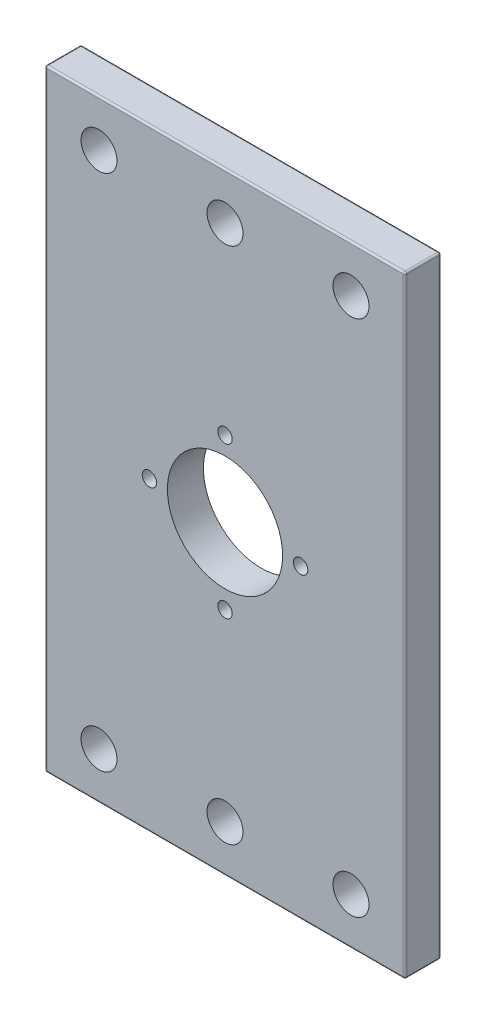
ISO-10303-21;
HEADER;
FILE_DESCRIPTION(('STEP AP214'),'2;1');
FILE_NAME('part.step','',(''),(''),'','','');
FILE_SCHEMA(('AUTOMOTIVE_DESIGN { 1 0 10303 214 1 1 1 1 }'));
ENDSEC;
DATA;
#1=APPLICATION_CONTEXT('core data for automotive mechanical design processes');
#2=APPLICATION_PROTOCOL_DEFINITION('international standard','automotive_design',2000,#1);
#3=PRODUCT_CONTEXT('',#1,'mechanical');
#4=PRODUCT('Part','Part','',(#3));
#5=PRODUCT_RELATED_PRODUCT_CATEGORY('part','',(#4));
#6=PRODUCT_DEFINITION_FORMATION('','',#4);
#7=PRODUCT_DEFINITION_CONTEXT('part definition',#1,'design');
#8=PRODUCT_DEFINITION('design','',#6,#7);
#9=PRODUCT_DEFINITION_SHAPE('','',#8);
#10=(LENGTH_UNIT() NAMED_UNIT(*) SI_UNIT(.MILLI.,.METRE.));
#11=(NAMED_UNIT(*) PLANE_ANGLE_UNIT() SI_UNIT($,.RADIAN.));
#12=(NAMED_UNIT(*) SI_UNIT($,.STERADIAN.) SOLID_ANGLE_UNIT());
#13=UNCERTAINTY_MEASURE_WITH_UNIT(LENGTH_MEASURE(1.E-05),#10,'distance_accuracy_value','');
#14=(GEOMETRIC_REPRESENTATION_CONTEXT(3) GLOBAL_UNCERTAINTY_ASSIGNED_CONTEXT((#13)) GLOBAL_UNIT_ASSIGNED_CONTEXT((#10,
#11,#12)) REPRESENTATION_CONTEXT('',''));
#15=CARTESIAN_POINT('',(0.,0.,0.));
#16=DIRECTION('',(0.,0.,1.));
#17=DIRECTION('',(1.,0.,0.));
#18=AXIS2_PLACEMENT_3D('',#15,#16,#17);
#19=CARTESIAN_POINT('',(50.,85.,10.));
#20=DIRECTION('',(0.,-1.,0.));
#21=DIRECTION('',(1.,0.,0.));
#22=AXIS2_PLACEMENT_3D('',#19,#20,#21);
#23=PLANE('',#22);
#24=DIRECTION('',(0.,0.,-1.));
#25=VECTOR('',#24,1.);
#26=CARTESIAN_POINT('',(49.5,85.,0.));
#27=LINE('',#26,#25);
#28=CARTESIAN_POINT('',(49.5,85.,9.5));
#29=VERTEX_POINT('',#28);
#30=CARTESIAN_POINT('',(49.5,85.,0.5));
#31=VERTEX_POINT('',#30);
#32=EDGE_CURVE('E60',#29,#31,#27,.T.);
#33=ORIENTED_EDGE('',*,*,#32,.T.);
#34=DIRECTION('',(-1.,0.,0.));
#35=VECTOR('',#34,1.);
#36=CARTESIAN_POINT('',(50.,85.,0.5));
#37=LINE('',#36,#35);
#38=CARTESIAN_POINT('',(-49.5,85.,0.5));
#39=VERTEX_POINT('',#38);
#40=EDGE_CURVE('E11',#31,#39,#37,.T.);
#41=ORIENTED_EDGE('',*,*,#40,.T.);
#42=DIRECTION('',(0.,0.,-1.));
#43=VECTOR('',#42,1.);
#44=CARTESIAN_POINT('',(-49.5,85.,10.));
#45=LINE('',#44,#43);
#46=CARTESIAN_POINT('',(-49.5,85.,9.5));
#47=VERTEX_POINT('',#46);
#48=EDGE_CURVE('E49',#39,#47,#45,.F.);
#49=ORIENTED_EDGE('',*,*,#48,.T.);
#50=DIRECTION('',(-1.,0.,0.));
#51=VECTOR('',#50,1.);
#52=CARTESIAN_POINT('',(50.,85.,9.5));
#53=LINE('',#52,#51);
#54=EDGE_CURVE('E225',#47,#29,#53,.F.);
#55=ORIENTED_EDGE('',*,*,#54,.T.);
#56=EDGE_LOOP('',(#33,#41,#49,#55));
#57=FACE_BOUND('',#56,.T.);
#58=ADVANCED_FACE('F39',(#57),#23,.F.);
#59=CARTESIAN_POINT('',(-50.,-85.,10.));
#60=DIRECTION('',(-1.,0.,0.));
#61=DIRECTION('',(0.,-1.,0.));
#62=AXIS2_PLACEMENT_3D('',#59,#60,#61);
#63=PLANE('',#62);
#64=DIRECTION('',(0.,0.,-1.));
#65=VECTOR('',#64,1.);
#66=CARTESIAN_POINT('',(-50.,84.5,0.));
#67=LINE('',#66,#65);
#68=CARTESIAN_POINT('',(-50.,84.5,9.5));
#69=VERTEX_POINT('',#68);
#70=CARTESIAN_POINT('',(-50.,84.5,0.5));
#71=VERTEX_POINT('',#70);
#72=EDGE_CURVE('E215',#69,#71,#67,.T.);
#73=ORIENTED_EDGE('',*,*,#72,.T.);
#74=DIRECTION('',(0.,1.,0.));
#75=VECTOR('',#74,1.);
#76=CARTESIAN_POINT('',(-50.,-85.,0.5));
#77=LINE('',#76,#75);
#78=CARTESIAN_POINT('',(-50.,-84.5,0.5));
#79=VERTEX_POINT('',#78);
#80=EDGE_CURVE('E222',#71,#79,#77,.F.);
#81=ORIENTED_EDGE('',*,*,#80,.T.);
#82=DIRECTION('',(0.,0.,-1.));
#83=VECTOR('',#82,1.);
#84=CARTESIAN_POINT('',(-50.,-84.5,10.));
#85=LINE('',#84,#83);
#86=CARTESIAN_POINT('',(-50.,-84.5,9.5));
#87=VERTEX_POINT('',#86);
#88=EDGE_CURVE('E218',#79,#87,#85,.F.);
#89=ORIENTED_EDGE('',*,*,#88,.T.);
#90=DIRECTION('',(0.,1.,0.));
#91=VECTOR('',#90,1.);
#92=CARTESIAN_POINT('',(-50.,-85.,9.5));
#93=LINE('',#92,#91);
#94=EDGE_CURVE('E212',#87,#69,#93,.T.);
#95=ORIENTED_EDGE('',*,*,#94,.T.);
#96=EDGE_LOOP('',(#73,#81,#89,#95));
#97=FACE_BOUND('',#96,.T.);
#98=ADVANCED_FACE('F417',(#97),#63,.T.);
#99=CARTESIAN_POINT('',(50.,-85.,10.));
#100=DIRECTION('',(0.,-1.,0.));
#101=DIRECTION('',(1.,0.,0.));
#102=AXIS2_PLACEMENT_3D('',#99,#100,#101);
#103=PLANE('',#102);
#104=DIRECTION('',(-1.,0.,0.));
#105=VECTOR('',#104,1.);
#106=CARTESIAN_POINT('',(50.,-85.,0.5));
#107=LINE('',#106,#105);
#108=CARTESIAN_POINT('',(-49.5,-85.,0.5));
#109=VERTEX_POINT('',#108);
#110=CARTESIAN_POINT('',(49.5,-85.,0.5));
#111=VERTEX_POINT('',#110);
#112=EDGE_CURVE('E135',#109,#111,#107,.F.);
#113=ORIENTED_EDGE('',*,*,#112,.T.);
#114=DIRECTION('',(0.,0.,-1.));
#115=VECTOR('',#114,1.);
#116=CARTESIAN_POINT('',(49.5,-85.,10.));
#117=LINE('',#116,#115);
#118=CARTESIAN_POINT('',(49.5,-85.,9.5));
#119=VERTEX_POINT('',#118);
#120=EDGE_CURVE('E183',#111,#119,#117,.F.);
#121=ORIENTED_EDGE('',*,*,#120,.T.);
#122=DIRECTION('',(-1.,0.,0.));
#123=VECTOR('',#122,1.);
#124=CARTESIAN_POINT('',(50.,-85.,9.5));
#125=LINE('',#124,#123);
#126=CARTESIAN_POINT('',(-49.5,-85.,9.5));
#127=VERTEX_POINT('',#126);
#128=EDGE_CURVE('E178',#119,#127,#125,.T.);
#129=ORIENTED_EDGE('',*,*,#128,.T.);
#130=DIRECTION('',(0.,0.,-1.));
#131=VECTOR('',#130,1.);
#132=CARTESIAN_POINT('',(-49.5,-85.,10.));
#133=LINE('',#132,#131);
#134=EDGE_CURVE('E172',#127,#109,#133,.T.);
#135=ORIENTED_EDGE('',*,*,#134,.T.);
#136=EDGE_LOOP('',(#113,#121,#129,#135));
#137=FACE_BOUND('',#136,.T.);
#138=ADVANCED_FACE('F412',(#137),#103,.T.);
#139=CARTESIAN_POINT('',(50.,0.,10.));
#140=DIRECTION('',(1.,0.,0.));
#141=DIRECTION('',(0.,1.,0.));
#142=AXIS2_PLACEMENT_3D('',#139,#140,#141);
#143=PLANE('',#142);
#144=DIRECTION('',(0.,0.,-1.));
#145=VECTOR('',#144,1.);
#146=CARTESIAN_POINT('',(50.,-84.5,10.));
#147=LINE('',#146,#145);
#148=CARTESIAN_POINT('',(50.,-84.5,9.5));
#149=VERTEX_POINT('',#148);
#150=CARTESIAN_POINT('',(50.,-84.5,0.5));
#151=VERTEX_POINT('',#150);
#152=EDGE_CURVE('E205',#149,#151,#147,.T.);
#153=ORIENTED_EDGE('',*,*,#152,.T.);
#154=DIRECTION('',(0.,-1.,0.));
#155=VECTOR('',#154,1.);
#156=CARTESIAN_POINT('',(50.,85.,0.5));
#157=LINE('',#156,#155);
#158=CARTESIAN_POINT('',(50.,84.5,0.5));
#159=VERTEX_POINT('',#158);
#160=EDGE_CURVE('E209',#151,#159,#157,.F.);
#161=ORIENTED_EDGE('',*,*,#160,.T.);
#162=DIRECTION('',(0.,0.,-1.));
#163=VECTOR('',#162,1.);
#164=CARTESIAN_POINT('',(50.,84.5,10.));
#165=LINE('',#164,#163);
#166=CARTESIAN_POINT('',(50.,84.5,9.5));
#167=VERTEX_POINT('',#166);
#168=EDGE_CURVE('E202',#159,#167,#165,.F.);
#169=ORIENTED_EDGE('',*,*,#168,.T.);
#170=DIRECTION('',(0.,1.,0.));
#171=VECTOR('',#170,1.);
#172=CARTESIAN_POINT('',(50.,0.,9.5));
#173=LINE('',#172,#171);
#174=EDGE_CURVE('E199',#167,#149,#173,.F.);
#175=ORIENTED_EDGE('',*,*,#174,.T.);
#176=EDGE_LOOP('',(#153,#161,#169,#175));
#177=FACE_BOUND('',#176,.T.);
#178=ADVANCED_FACE('F404',(#177),#143,.T.);
#179=CARTESIAN_POINT('',(0.,0.,10.));
#180=DIRECTION('',(0.,0.,1.));
#181=DIRECTION('',(1.,0.,0.));
#182=AXIS2_PLACEMENT_3D('',#179,#180,#181);
#183=PLANE('',#182);
#184=DIRECTION('',(-1.,0.,0.));
#185=VECTOR('',#184,1.);
#186=CARTESIAN_POINT('',(0.,-84.5,10.));
#187=LINE('',#186,#185);
#188=CARTESIAN_POINT('',(-49.5,-84.5,10.));
#189=VERTEX_POINT('',#188);
#190=CARTESIAN_POINT('',(49.5,-84.5,10.));
#191=VERTEX_POINT('',#190);
#192=EDGE_CURVE('E192',#189,#191,#187,.F.);
#193=ORIENTED_EDGE('',*,*,#192,.T.);
#194=DIRECTION('',(0.,1.,0.));
#195=VECTOR('',#194,1.);
#196=CARTESIAN_POINT('',(49.5,0.,10.));
#197=LINE('',#196,#195);
#198=CARTESIAN_POINT('',(49.5,84.5,10.));
#199=VERTEX_POINT('',#198);
#200=EDGE_CURVE('E196',#191,#199,#197,.T.);
#201=ORIENTED_EDGE('',*,*,#200,.T.);
#202=DIRECTION('',(-1.,0.,0.));
#203=VECTOR('',#202,1.);
#204=CARTESIAN_POINT('',(-50.,84.5,10.));
#205=LINE('',#204,#203);
#206=CARTESIAN_POINT('',(-49.5,84.5,10.));
#207=VERTEX_POINT('',#206);
#208=EDGE_CURVE('E189',#199,#207,#205,.T.);
#209=ORIENTED_EDGE('',*,*,#208,.T.);
#210=DIRECTION('',(0.,1.,0.));
#211=VECTOR('',#210,1.);
#212=CARTESIAN_POINT('',(-49.5,0.,10.));
#213=LINE('',#212,#211);
#214=EDGE_CURVE('E186',#207,#189,#213,.F.);
#215=ORIENTED_EDGE('',*,*,#214,.T.);
#216=EDGE_LOOP('',(#193,#201,#209,#215));
#217=FACE_BOUND('',#216,.T.);
#218=CARTESIAN_POINT('',(-35.,72.,10.));
#219=DIRECTION('',(0.,0.,-1.));
#220=DIRECTION('',(1.,0.,0.));
#221=AXIS2_PLACEMENT_3D('',#218,#219,#220);
#222=CIRCLE('',#221,5.);
#223=CARTESIAN_POINT('',(-30.,72.,10.));
#224=VERTEX_POINT('',#223);
#225=EDGE_CURVE('E310',#224,#224,#222,.T.);
#226=ORIENTED_EDGE('',*,*,#225,.T.);
#227=EDGE_LOOP('',(#226));
#228=FACE_BOUND('',#227,.T.);
#229=CARTESIAN_POINT('',(35.,72.,10.));
#230=DIRECTION('',(0.,0.,-1.));
#231=DIRECTION('',(1.,0.,0.));
#232=AXIS2_PLACEMENT_3D('',#229,#230,#231);
#233=CIRCLE('',#232,5.);
#234=CARTESIAN_POINT('',(40.,72.,10.));
#235=VERTEX_POINT('',#234);
#236=EDGE_CURVE('E323',#235,#235,#233,.T.);
#237=ORIENTED_EDGE('',*,*,#236,.T.);
#238=EDGE_LOOP('',(#237));
#239=FACE_BOUND('',#238,.T.);
#240=CARTESIAN_POINT('',(0.,72.,10.));
#241=DIRECTION('',(0.,0.,-1.));
#242=DIRECTION('',(1.,0.,0.));
#243=AXIS2_PLACEMENT_3D('',#240,#241,#242);
#244=CIRCLE('',#243,5.);
#245=CARTESIAN_POINT('',(5.00000000000001,72.,10.));
#246=VERTEX_POINT('',#245);
#247=EDGE_CURVE('E332',#246,#246,#244,.T.);
#248=ORIENTED_EDGE('',*,*,#247,.T.);
#249=EDGE_LOOP('',(#248));
#250=FACE_BOUND('',#249,.T.);
#251=CARTESIAN_POINT('',(-21.,0.,10.));
#252=DIRECTION('',(0.,0.,1.));
#253=DIRECTION('',(0.,1.,0.));
#254=AXIS2_PLACEMENT_3D('',#251,#252,#253);
#255=CIRCLE('',#254,2.);
#256=CARTESIAN_POINT('',(-21.,1.99999999999993,10.));
#257=VERTEX_POINT('',#256);
#258=EDGE_CURVE('E342',#257,#257,#255,.T.);
#259=ORIENTED_EDGE('',*,*,#258,.F.);
#260=EDGE_LOOP('',(#259));
#261=FACE_BOUND('',#260,.T.);
#262=CARTESIAN_POINT('',(0.,-21.,10.));
#263=DIRECTION('',(0.,0.,1.));
#264=DIRECTION('',(-1.,0.,0.));
#265=AXIS2_PLACEMENT_3D('',#262,#263,#264);
#266=CIRCLE('',#265,2.);
#267=CARTESIAN_POINT('',(-2.,-21.,10.));
#268=VERTEX_POINT('',#267);
#269=EDGE_CURVE('E350',#268,#268,#266,.T.);
#270=ORIENTED_EDGE('',*,*,#269,.F.);
#271=EDGE_LOOP('',(#270));
#272=FACE_BOUND('',#271,.T.);
#273=CARTESIAN_POINT('',(21.,2.19963324347117E-13,10.));
#274=DIRECTION('',(0.,0.,1.));
#275=DIRECTION('',(0.,-1.,0.));
#276=AXIS2_PLACEMENT_3D('',#273,#274,#275);
#277=CIRCLE('',#276,2.);
#278=CARTESIAN_POINT('',(21.,-1.99999999999978,10.));
#279=VERTEX_POINT('',#278);
#280=EDGE_CURVE('E331',#279,#279,#277,.T.);
#281=ORIENTED_EDGE('',*,*,#280,.F.);
#282=EDGE_LOOP('',(#281));
#283=FACE_BOUND('',#282,.T.);
#284=CARTESIAN_POINT('',(0.,21.,10.));
#285=DIRECTION('',(0.,0.,1.));
#286=DIRECTION('',(1.,0.,0.));
#287=AXIS2_PLACEMENT_3D('',#284,#285,#286);
#288=CIRCLE('',#287,2.);
#289=CARTESIAN_POINT('',(2.,21.,10.));
#290=VERTEX_POINT('',#289);
#291=EDGE_CURVE('E341',#290,#290,#288,.T.);
#292=ORIENTED_EDGE('',*,*,#291,.F.);
#293=EDGE_LOOP('',(#292));
#294=FACE_BOUND('',#293,.T.);
#295=CARTESIAN_POINT('',(-35.,-72.,10.));
#296=DIRECTION('',(0.,0.,1.));
#297=DIRECTION('',(1.,0.,0.));
#298=AXIS2_PLACEMENT_3D('',#295,#296,#297);
#299=CIRCLE('',#298,5.);
#300=CARTESIAN_POINT('',(-30.,-72.,10.));
#301=VERTEX_POINT('',#300);
#302=EDGE_CURVE('E365',#301,#301,#299,.T.);
#303=ORIENTED_EDGE('',*,*,#302,.F.);
#304=EDGE_LOOP('',(#303));
#305=FACE_BOUND('',#304,.T.);
#306=CARTESIAN_POINT('',(35.,-72.,10.));
#307=DIRECTION('',(0.,0.,1.));
#308=DIRECTION('',(1.,0.,0.));
#309=AXIS2_PLACEMENT_3D('',#306,#307,#308);
#310=CIRCLE('',#309,5.);
#311=CARTESIAN_POINT('',(40.,-72.,10.));
#312=VERTEX_POINT('',#311);
#313=EDGE_CURVE('E374',#312,#312,#310,.T.);
#314=ORIENTED_EDGE('',*,*,#313,.F.);
#315=EDGE_LOOP('',(#314));
#316=FACE_BOUND('',#315,.T.);
#317=CARTESIAN_POINT('',(0.,-72.,10.));
#318=DIRECTION('',(0.,0.,1.));
#319=DIRECTION('',(1.,0.,0.));
#320=AXIS2_PLACEMENT_3D('',#317,#318,#319);
#321=CIRCLE('',#320,5.);
#322=CARTESIAN_POINT('',(5.00000000000001,-72.,10.));
#323=VERTEX_POINT('',#322);
#324=EDGE_CURVE('E373',#323,#323,#321,.T.);
#325=ORIENTED_EDGE('',*,*,#324,.F.);
#326=EDGE_LOOP('',(#325));
#327=FACE_BOUND('',#326,.T.);
#328=CARTESIAN_POINT('',(0.,0.,10.));
#329=DIRECTION('',(0.,0.,1.));
#330=DIRECTION('',(1.,0.,0.));
#331=AXIS2_PLACEMENT_3D('',#328,#329,#330);
#332=CIRCLE('',#331,16.);
#333=CARTESIAN_POINT('',(16.,0.,10.));
#334=VERTEX_POINT('',#333);
#335=EDGE_CURVE('E389',#334,#334,#332,.T.);
#336=ORIENTED_EDGE('',*,*,#335,.F.);
#337=EDGE_LOOP('',(#336));
#338=FACE_BOUND('',#337,.T.);
#339=ADVANCED_FACE('F402',(#217,#228,#239,#250,#261,#272,#283,#294,#305,#316,#327,#338),#183,.T.);
#340=CARTESIAN_POINT('',(0.,0.,0.));
#341=DIRECTION('',(0.,0.,1.));
#342=DIRECTION('',(1.,0.,0.));
#343=AXIS2_PLACEMENT_3D('',#340,#341,#342);
#344=PLANE('',#343);
#345=DIRECTION('',(-1.,0.,0.));
#346=VECTOR('',#345,1.);
#347=CARTESIAN_POINT('',(0.,84.5,0.));
#348=LINE('',#347,#346);
#349=CARTESIAN_POINT('',(-49.5,84.5,0.));
#350=VERTEX_POINT('',#349);
#351=CARTESIAN_POINT('',(49.5,84.5,0.));
#352=VERTEX_POINT('',#351);
#353=EDGE_CURVE('E160',#350,#352,#348,.F.);
#354=ORIENTED_EDGE('',*,*,#353,.T.);
#355=DIRECTION('',(0.,-1.,0.));
#356=VECTOR('',#355,1.);
#357=CARTESIAN_POINT('',(49.5,-85.,0.));
#358=LINE('',#357,#356);
#359=CARTESIAN_POINT('',(49.5,-84.5,0.));
#360=VERTEX_POINT('',#359);
#361=EDGE_CURVE('E166',#352,#360,#358,.T.);
#362=ORIENTED_EDGE('',*,*,#361,.T.);
#363=DIRECTION('',(-1.,0.,0.));
#364=VECTOR('',#363,1.);
#365=CARTESIAN_POINT('',(-50.,-84.5,0.));
#366=LINE('',#365,#364);
#367=CARTESIAN_POINT('',(-49.5,-84.5,0.));
#368=VERTEX_POINT('',#367);
#369=EDGE_CURVE('E133',#360,#368,#366,.T.);
#370=ORIENTED_EDGE('',*,*,#369,.T.);
#371=DIRECTION('',(0.,1.,0.));
#372=VECTOR('',#371,1.);
#373=CARTESIAN_POINT('',(-49.5,85.,0.));
#374=LINE('',#373,#372);
#375=EDGE_CURVE('E153',#368,#350,#374,.T.);
#376=ORIENTED_EDGE('',*,*,#375,.T.);
#377=EDGE_LOOP('',(#354,#362,#370,#376));
#378=FACE_BOUND('',#377,.T.);
#379=CARTESIAN_POINT('',(-35.,72.,0.));
#380=DIRECTION('',(0.,0.,-1.));
#381=DIRECTION('',(1.,0.,0.));
#382=AXIS2_PLACEMENT_3D('',#379,#380,#381);
#383=CIRCLE('',#382,5.);
#384=CARTESIAN_POINT('',(-30.,72.,0.));
#385=VERTEX_POINT('',#384);
#386=EDGE_CURVE('E317',#385,#385,#383,.T.);
#387=ORIENTED_EDGE('',*,*,#386,.F.);
#388=EDGE_LOOP('',(#387));
#389=FACE_BOUND('',#388,.T.);
#390=CARTESIAN_POINT('',(35.,72.,0.));
#391=DIRECTION('',(0.,0.,-1.));
#392=DIRECTION('',(1.,0.,0.));
#393=AXIS2_PLACEMENT_3D('',#390,#391,#392);
#394=CIRCLE('',#393,5.);
#395=CARTESIAN_POINT('',(40.,72.,0.));
#396=VERTEX_POINT('',#395);
#397=EDGE_CURVE('E336',#396,#396,#394,.T.);
#398=ORIENTED_EDGE('',*,*,#397,.F.);
#399=EDGE_LOOP('',(#398));
#400=FACE_BOUND('',#399,.T.);
#401=CARTESIAN_POINT('',(0.,72.,0.));
#402=DIRECTION('',(0.,0.,-1.));
#403=DIRECTION('',(1.,0.,0.));
#404=AXIS2_PLACEMENT_3D('',#401,#402,#403);
#405=CIRCLE('',#404,5.);
#406=CARTESIAN_POINT('',(5.00000000000001,72.,0.));
#407=VERTEX_POINT('',#406);
#408=EDGE_CURVE('E327',#407,#407,#405,.T.);
#409=ORIENTED_EDGE('',*,*,#408,.F.);
#410=EDGE_LOOP('',(#409));
#411=FACE_BOUND('',#410,.T.);
#412=CARTESIAN_POINT('',(-21.,0.,0.));
#413=DIRECTION('',(0.,0.,1.));
#414=DIRECTION('',(0.,1.,0.));
#415=AXIS2_PLACEMENT_3D('',#412,#413,#414);
#416=CIRCLE('',#415,2.);
#417=CARTESIAN_POINT('',(-21.,1.99999999999993,0.));
#418=VERTEX_POINT('',#417);
#419=EDGE_CURVE('E337',#418,#418,#416,.T.);
#420=ORIENTED_EDGE('',*,*,#419,.T.);
#421=EDGE_LOOP('',(#420));
#422=FACE_BOUND('',#421,.T.);
#423=CARTESIAN_POINT('',(0.,-21.,0.));
#424=DIRECTION('',(0.,0.,1.));
#425=DIRECTION('',(-1.,0.,0.));
#426=AXIS2_PLACEMENT_3D('',#423,#424,#425);
#427=CIRCLE('',#426,2.);
#428=CARTESIAN_POINT('',(-2.,-21.,0.));
#429=VERTEX_POINT('',#428);
#430=EDGE_CURVE('E346',#429,#429,#427,.T.);
#431=ORIENTED_EDGE('',*,*,#430,.T.);
#432=EDGE_LOOP('',(#431));
#433=FACE_BOUND('',#432,.T.);
#434=CARTESIAN_POINT('',(21.,2.19963324347117E-13,0.));
#435=DIRECTION('',(0.,0.,1.));
#436=DIRECTION('',(0.,-1.,0.));
#437=AXIS2_PLACEMENT_3D('',#434,#435,#436);
#438=CIRCLE('',#437,2.);
#439=CARTESIAN_POINT('',(21.,-1.99999999999978,0.));
#440=VERTEX_POINT('',#439);
#441=EDGE_CURVE('E354',#440,#440,#438,.T.);
#442=ORIENTED_EDGE('',*,*,#441,.T.);
#443=EDGE_LOOP('',(#442));
#444=FACE_BOUND('',#443,.T.);
#445=CARTESIAN_POINT('',(0.,21.,0.));
#446=DIRECTION('',(0.,0.,1.));
#447=DIRECTION('',(1.,0.,0.));
#448=AXIS2_PLACEMENT_3D('',#445,#446,#447);
#449=CIRCLE('',#448,2.);
#450=CARTESIAN_POINT('',(2.,21.,0.));
#451=VERTEX_POINT('',#450);
#452=EDGE_CURVE('E361',#451,#451,#449,.T.);
#453=ORIENTED_EDGE('',*,*,#452,.T.);
#454=EDGE_LOOP('',(#453));
#455=FACE_BOUND('',#454,.T.);
#456=CARTESIAN_POINT('',(-35.,-72.,0.));
#457=DIRECTION('',(0.,0.,1.));
#458=DIRECTION('',(1.,0.,0.));
#459=AXIS2_PLACEMENT_3D('',#456,#457,#458);
#460=CIRCLE('',#459,5.);
#461=CARTESIAN_POINT('',(-30.,-72.,0.));
#462=VERTEX_POINT('',#461);
#463=EDGE_CURVE('E378',#462,#462,#460,.T.);
#464=ORIENTED_EDGE('',*,*,#463,.T.);
#465=EDGE_LOOP('',(#464));
#466=FACE_BOUND('',#465,.T.);
#467=CARTESIAN_POINT('',(35.,-72.,0.));
#468=DIRECTION('',(0.,0.,1.));
#469=DIRECTION('',(1.,0.,0.));
#470=AXIS2_PLACEMENT_3D('',#467,#468,#469);
#471=CIRCLE('',#470,5.);
#472=CARTESIAN_POINT('',(40.,-72.,0.));
#473=VERTEX_POINT('',#472);
#474=EDGE_CURVE('E369',#473,#473,#471,.T.);
#475=ORIENTED_EDGE('',*,*,#474,.T.);
#476=EDGE_LOOP('',(#475));
#477=FACE_BOUND('',#476,.T.);
#478=CARTESIAN_POINT('',(0.,-72.,0.));
#479=DIRECTION('',(0.,0.,1.));
#480=DIRECTION('',(1.,0.,0.));
#481=AXIS2_PLACEMENT_3D('',#478,#479,#480);
#482=CIRCLE('',#481,5.);
#483=CARTESIAN_POINT('',(5.00000000000001,-72.,0.));
#484=VERTEX_POINT('',#483);
#485=EDGE_CURVE('E385',#484,#484,#482,.T.);
#486=ORIENTED_EDGE('',*,*,#485,.T.);
#487=EDGE_LOOP('',(#486));
#488=FACE_BOUND('',#487,.T.);
#489=CARTESIAN_POINT('',(0.,0.,0.));
#490=DIRECTION('',(0.,0.,1.));
#491=DIRECTION('',(1.,0.,0.));
#492=AXIS2_PLACEMENT_3D('',#489,#490,#491);
#493=CIRCLE('',#492,16.);
#494=CARTESIAN_POINT('',(16.,0.,0.));
#495=VERTEX_POINT('',#494);
#496=EDGE_CURVE('E161',#495,#495,#493,.T.);
#497=ORIENTED_EDGE('',*,*,#496,.T.);
#498=EDGE_LOOP('',(#497));
#499=FACE_BOUND('',#498,.T.);
#500=ADVANCED_FACE('F163',(#378,#389,#400,#411,#422,#433,#444,#455,#466,#477,#488,#499),#344,.F.);
#501=CARTESIAN_POINT('',(0.,0.,0.));
#502=DIRECTION('',(0.,0.,1.));
#503=DIRECTION('',(1.,0.,0.));
#504=AXIS2_PLACEMENT_3D('',#501,#502,#503);
#505=CYLINDRICAL_SURFACE('',#504,16.);
#506=ORIENTED_EDGE('',*,*,#496,.F.);
#507=EDGE_LOOP('',(#506));
#508=FACE_BOUND('',#507,.T.);
#509=ORIENTED_EDGE('',*,*,#335,.T.);
#510=EDGE_LOOP('',(#509));
#511=FACE_BOUND('',#510,.T.);
#512=ADVANCED_FACE('F400',(#508,#511),#505,.F.);
#513=CARTESIAN_POINT('',(0.,-72.,0.));
#514=DIRECTION('',(0.,0.,1.));
#515=DIRECTION('',(1.,0.,0.));
#516=AXIS2_PLACEMENT_3D('',#513,#514,#515);
#517=CYLINDRICAL_SURFACE('',#516,5.);
#518=ORIENTED_EDGE('',*,*,#485,.F.);
#519=EDGE_LOOP('',(#518));
#520=FACE_BOUND('',#519,.T.);
#521=ORIENTED_EDGE('',*,*,#324,.T.);
#522=EDGE_LOOP('',(#521));
#523=FACE_BOUND('',#522,.T.);
#524=ADVANCED_FACE('F737',(#520,#523),#517,.F.);
#525=CARTESIAN_POINT('',(35.,-72.,0.));
#526=DIRECTION('',(0.,0.,1.));
#527=DIRECTION('',(1.,0.,0.));
#528=AXIS2_PLACEMENT_3D('',#525,#526,#527);
#529=CYLINDRICAL_SURFACE('',#528,5.);
#530=ORIENTED_EDGE('',*,*,#474,.F.);
#531=EDGE_LOOP('',(#530));
#532=FACE_BOUND('',#531,.T.);
#533=ORIENTED_EDGE('',*,*,#313,.T.);
#534=EDGE_LOOP('',(#533));
#535=FACE_BOUND('',#534,.T.);
#536=ADVANCED_FACE('F729',(#532,#535),#529,.F.);
#537=CARTESIAN_POINT('',(-35.,-72.,0.));
#538=DIRECTION('',(0.,0.,1.));
#539=DIRECTION('',(1.,0.,0.));
#540=AXIS2_PLACEMENT_3D('',#537,#538,#539);
#541=CYLINDRICAL_SURFACE('',#540,5.);
#542=ORIENTED_EDGE('',*,*,#463,.F.);
#543=EDGE_LOOP('',(#542));
#544=FACE_BOUND('',#543,.T.);
#545=ORIENTED_EDGE('',*,*,#302,.T.);
#546=EDGE_LOOP('',(#545));
#547=FACE_BOUND('',#546,.T.);
#548=ADVANCED_FACE('F721',(#544,#547),#541,.F.);
#549=CARTESIAN_POINT('',(0.,21.,0.));
#550=DIRECTION('',(0.,0.,1.));
#551=DIRECTION('',(1.,0.,0.));
#552=AXIS2_PLACEMENT_3D('',#549,#550,#551);
#553=CYLINDRICAL_SURFACE('',#552,2.);
#554=ORIENTED_EDGE('',*,*,#452,.F.);
#555=EDGE_LOOP('',(#554));
#556=FACE_BOUND('',#555,.T.);
#557=ORIENTED_EDGE('',*,*,#291,.T.);
#558=EDGE_LOOP('',(#557));
#559=FACE_BOUND('',#558,.T.);
#560=ADVANCED_FACE('F713',(#556,#559),#553,.F.);
#561=CARTESIAN_POINT('',(21.,2.19963324347117E-13,0.));
#562=DIRECTION('',(0.,0.,1.));
#563=DIRECTION('',(1.,0.,0.));
#564=AXIS2_PLACEMENT_3D('',#561,#562,#563);
#565=CYLINDRICAL_SURFACE('',#564,2.);
#566=ORIENTED_EDGE('',*,*,#441,.F.);
#567=EDGE_LOOP('',(#566));
#568=FACE_BOUND('',#567,.T.);
#569=ORIENTED_EDGE('',*,*,#280,.T.);
#570=EDGE_LOOP('',(#569));
#571=FACE_BOUND('',#570,.T.);
#572=ADVANCED_FACE('F705',(#568,#571),#565,.F.);
#573=CARTESIAN_POINT('',(0.,-21.,0.));
#574=DIRECTION('',(0.,0.,1.));
#575=DIRECTION('',(1.,0.,0.));
#576=AXIS2_PLACEMENT_3D('',#573,#574,#575);
#577=CYLINDRICAL_SURFACE('',#576,2.);
#578=ORIENTED_EDGE('',*,*,#430,.F.);
#579=EDGE_LOOP('',(#578));
#580=FACE_BOUND('',#579,.T.);
#581=ORIENTED_EDGE('',*,*,#269,.T.);
#582=EDGE_LOOP('',(#581));
#583=FACE_BOUND('',#582,.T.);
#584=ADVANCED_FACE('F697',(#580,#583),#577,.F.);
#585=CARTESIAN_POINT('',(-21.,0.,0.));
#586=DIRECTION('',(0.,0.,1.));
#587=DIRECTION('',(1.,0.,0.));
#588=AXIS2_PLACEMENT_3D('',#585,#586,#587);
#589=CYLINDRICAL_SURFACE('',#588,2.);
#590=ORIENTED_EDGE('',*,*,#419,.F.);
#591=EDGE_LOOP('',(#590));
#592=FACE_BOUND('',#591,.T.);
#593=ORIENTED_EDGE('',*,*,#258,.T.);
#594=EDGE_LOOP('',(#593));
#595=FACE_BOUND('',#594,.T.);
#596=ADVANCED_FACE('F689',(#592,#595),#589,.F.);
#597=CARTESIAN_POINT('',(0.,72.,0.));
#598=DIRECTION('',(0.,0.,1.));
#599=DIRECTION('',(1.,0.,0.));
#600=AXIS2_PLACEMENT_3D('',#597,#598,#599);
#601=CYLINDRICAL_SURFACE('',#600,5.);
#602=ORIENTED_EDGE('',*,*,#408,.T.);
#603=EDGE_LOOP('',(#602));
#604=FACE_BOUND('',#603,.T.);
#605=ORIENTED_EDGE('',*,*,#247,.F.);
#606=EDGE_LOOP('',(#605));
#607=FACE_BOUND('',#606,.T.);
#608=ADVANCED_FACE('F681',(#604,#607),#601,.F.);
#609=CARTESIAN_POINT('',(35.,72.,0.));
#610=DIRECTION('',(0.,0.,1.));
#611=DIRECTION('',(1.,0.,0.));
#612=AXIS2_PLACEMENT_3D('',#609,#610,#611);
#613=CYLINDRICAL_SURFACE('',#612,5.);
#614=ORIENTED_EDGE('',*,*,#397,.T.);
#615=EDGE_LOOP('',(#614));
#616=FACE_BOUND('',#615,.T.);
#617=ORIENTED_EDGE('',*,*,#236,.F.);
#618=EDGE_LOOP('',(#617));
#619=FACE_BOUND('',#618,.T.);
#620=ADVANCED_FACE('F674',(#616,#619),#613,.F.);
#621=CARTESIAN_POINT('',(-35.,72.,0.));
#622=DIRECTION('',(0.,0.,1.));
#623=DIRECTION('',(1.,0.,0.));
#624=AXIS2_PLACEMENT_3D('',#621,#622,#623);
#625=CYLINDRICAL_SURFACE('',#624,5.);
#626=ORIENTED_EDGE('',*,*,#386,.T.);
#627=EDGE_LOOP('',(#626));
#628=FACE_BOUND('',#627,.T.);
#629=ORIENTED_EDGE('',*,*,#225,.F.);
#630=EDGE_LOOP('',(#629));
#631=FACE_BOUND('',#630,.T.);
#632=ADVANCED_FACE('F495',(#628,#631),#625,.F.);
#633=CARTESIAN_POINT('',(0.,84.5,9.5));
#634=DIRECTION('',(1.,0.,0.));
#635=DIRECTION('',(0.,1.,0.));
#636=AXIS2_PLACEMENT_3D('',#633,#634,#635);
#637=CYLINDRICAL_SURFACE('',#636,0.5);
#638=CARTESIAN_POINT('',(49.5,84.5,9.5));
#639=DIRECTION('',(1.,0.,0.));
#640=DIRECTION('',(0.,0.,-1.));
#641=AXIS2_PLACEMENT_3D('',#638,#639,#640);
#642=CIRCLE('',#641,0.5);
#643=EDGE_CURVE('E43',#29,#199,#642,.T.);
#644=ORIENTED_EDGE('',*,*,#643,.F.);
#645=ORIENTED_EDGE('',*,*,#54,.F.);
#646=CARTESIAN_POINT('',(-49.5,84.5,9.5));
#647=DIRECTION('',(-1.,0.,0.));
#648=DIRECTION('',(0.,0.,1.));
#649=AXIS2_PLACEMENT_3D('',#646,#647,#648);
#650=CIRCLE('',#649,0.5);
#651=EDGE_CURVE('E300',#207,#47,#650,.T.);
#652=ORIENTED_EDGE('',*,*,#651,.F.);
#653=ORIENTED_EDGE('',*,*,#208,.F.);
#654=EDGE_LOOP('',(#644,#645,#652,#653));
#655=FACE_BOUND('',#654,.T.);
#656=ADVANCED_FACE('F41',(#655),#637,.T.);
#657=CARTESIAN_POINT('',(49.5,84.5,9.5));
#658=DIRECTION('',(0.,0.,1.));
#659=DIRECTION('',(1.,0.,0.));
#660=AXIS2_PLACEMENT_3D('',#657,#658,#659);
#661=SPHERICAL_SURFACE('',#660,0.5);
#662=CARTESIAN_POINT('',(49.5,84.5,9.5));
#663=DIRECTION('',(0.,0.,1.));
#664=DIRECTION('',(1.,0.,0.));
#665=AXIS2_PLACEMENT_3D('',#662,#663,#664);
#666=CIRCLE('',#665,0.5);
#667=EDGE_CURVE('E293',#29,#167,#666,.F.);
#668=ORIENTED_EDGE('',*,*,#667,.F.);
#669=ORIENTED_EDGE('',*,*,#643,.T.);
#670=CARTESIAN_POINT('',(49.5,84.5,9.5));
#671=DIRECTION('',(0.,1.,0.));
#672=DIRECTION('',(0.,0.,1.));
#673=AXIS2_PLACEMENT_3D('',#670,#671,#672);
#674=CIRCLE('',#673,0.5);
#675=EDGE_CURVE('E297',#167,#199,#674,.F.);
#676=ORIENTED_EDGE('',*,*,#675,.F.);
#677=EDGE_LOOP('',(#668,#669,#676));
#678=FACE_BOUND('',#677,.T.);
#679=ADVANCED_FACE('F490',(#678),#661,.T.);
#680=CARTESIAN_POINT('',(-49.5,84.5,9.5));
#681=DIRECTION('',(0.,1.,0.));
#682=DIRECTION('',(0.,0.,1.));
#683=AXIS2_PLACEMENT_3D('',#680,#681,#682);
#684=SPHERICAL_SURFACE('',#683,0.5);
#685=CARTESIAN_POINT('',(-49.5,84.5,9.5));
#686=DIRECTION('',(0.,1.,0.));
#687=DIRECTION('',(0.,0.,1.));
#688=AXIS2_PLACEMENT_3D('',#685,#686,#687);
#689=CIRCLE('',#688,0.5);
#690=EDGE_CURVE('E286',#207,#69,#689,.F.);
#691=ORIENTED_EDGE('',*,*,#690,.F.);
#692=ORIENTED_EDGE('',*,*,#651,.T.);
#693=CARTESIAN_POINT('',(-49.5,84.5,9.5));
#694=DIRECTION('',(0.,0.,1.));
#695=DIRECTION('',(1.,0.,0.));
#696=AXIS2_PLACEMENT_3D('',#693,#694,#695);
#697=CIRCLE('',#696,0.5);
#698=EDGE_CURVE('E290',#69,#47,#697,.F.);
#699=ORIENTED_EDGE('',*,*,#698,.F.);
#700=EDGE_LOOP('',(#691,#692,#699));
#701=FACE_BOUND('',#700,.T.);
#702=ADVANCED_FACE('F487',(#701),#684,.T.);
#703=CARTESIAN_POINT('',(49.5,0.,9.5));
#704=DIRECTION('',(0.,1.,0.));
#705=DIRECTION('',(-1.,0.,0.));
#706=AXIS2_PLACEMENT_3D('',#703,#704,#705);
#707=CYLINDRICAL_SURFACE('',#706,0.5);
#708=ORIENTED_EDGE('',*,*,#675,.T.);
#709=ORIENTED_EDGE('',*,*,#200,.F.);
#710=CARTESIAN_POINT('',(49.5,-84.5,9.5));
#711=DIRECTION('',(0.,-1.,0.));
#712=DIRECTION('',(0.,0.,-1.));
#713=AXIS2_PLACEMENT_3D('',#710,#711,#712);
#714=CIRCLE('',#713,0.5);
#715=EDGE_CURVE('E279',#149,#191,#714,.T.);
#716=ORIENTED_EDGE('',*,*,#715,.F.);
#717=ORIENTED_EDGE('',*,*,#174,.F.);
#718=EDGE_LOOP('',(#708,#709,#716,#717));
#719=FACE_BOUND('',#718,.T.);
#720=ADVANCED_FACE('F483',(#719),#707,.T.);
#721=CARTESIAN_POINT('',(49.5,84.5,10.));
#722=DIRECTION('',(0.,0.,1.));
#723=DIRECTION('',(1.,0.,0.));
#724=AXIS2_PLACEMENT_3D('',#721,#722,#723);
#725=CYLINDRICAL_SURFACE('',#724,0.5);
#726=ORIENTED_EDGE('',*,*,#667,.T.);
#727=ORIENTED_EDGE('',*,*,#168,.F.);
#728=CARTESIAN_POINT('',(49.5,84.5,0.5));
#729=DIRECTION('',(0.,0.,-1.));
#730=DIRECTION('',(-1.,0.,0.));
#731=AXIS2_PLACEMENT_3D('',#728,#729,#730);
#732=CIRCLE('',#731,0.5);
#733=EDGE_CURVE('E275',#31,#159,#732,.T.);
#734=ORIENTED_EDGE('',*,*,#733,.F.);
#735=ORIENTED_EDGE('',*,*,#32,.F.);
#736=EDGE_LOOP('',(#726,#727,#734,#735));
#737=FACE_BOUND('',#736,.T.);
#738=ADVANCED_FACE('F479',(#737),#725,.T.);
#739=CARTESIAN_POINT('',(50.,84.5,0.5));
#740=DIRECTION('',(-1.,0.,0.));
#741=DIRECTION('',(0.,-1.,0.));
#742=AXIS2_PLACEMENT_3D('',#739,#740,#741);
#743=CYLINDRICAL_SURFACE('',#742,0.5);
#744=CARTESIAN_POINT('',(-49.5,84.5,0.5));
#745=DIRECTION('',(-1.,0.,0.));
#746=DIRECTION('',(0.,0.,1.));
#747=AXIS2_PLACEMENT_3D('',#744,#745,#746);
#748=CIRCLE('',#747,0.5);
#749=EDGE_CURVE('E267',#39,#350,#748,.T.);
#750=ORIENTED_EDGE('',*,*,#749,.F.);
#751=ORIENTED_EDGE('',*,*,#40,.F.);
#752=CARTESIAN_POINT('',(49.5,84.5,0.5));
#753=DIRECTION('',(1.,0.,0.));
#754=DIRECTION('',(0.,0.,-1.));
#755=AXIS2_PLACEMENT_3D('',#752,#753,#754);
#756=CIRCLE('',#755,0.5);
#757=EDGE_CURVE('E271',#352,#31,#756,.T.);
#758=ORIENTED_EDGE('',*,*,#757,.F.);
#759=ORIENTED_EDGE('',*,*,#353,.F.);
#760=EDGE_LOOP('',(#750,#751,#758,#759));
#761=FACE_BOUND('',#760,.T.);
#762=ADVANCED_FACE('F475',(#761),#743,.T.);
#763=CARTESIAN_POINT('',(-49.5,84.5,10.));
#764=DIRECTION('',(0.,0.,1.));
#765=DIRECTION('',(1.,0.,0.));
#766=AXIS2_PLACEMENT_3D('',#763,#764,#765);
#767=CYLINDRICAL_SURFACE('',#766,0.5);
#768=ORIENTED_EDGE('',*,*,#698,.T.);
#769=ORIENTED_EDGE('',*,*,#48,.F.);
#770=CARTESIAN_POINT('',(-49.5,84.5,0.5));
#771=DIRECTION('',(0.,0.,-1.));
#772=DIRECTION('',(0.,1.,0.));
#773=AXIS2_PLACEMENT_3D('',#770,#771,#772);
#774=CIRCLE('',#773,0.5);
#775=EDGE_CURVE('E263',#71,#39,#774,.T.);
#776=ORIENTED_EDGE('',*,*,#775,.F.);
#777=ORIENTED_EDGE('',*,*,#72,.F.);
#778=EDGE_LOOP('',(#768,#769,#776,#777));
#779=FACE_BOUND('',#778,.T.);
#780=ADVANCED_FACE('F471',(#779),#767,.T.);
#781=CARTESIAN_POINT('',(-49.5,-85.,9.5));
#782=DIRECTION('',(0.,1.,0.));
#783=DIRECTION('',(-1.,0.,0.));
#784=AXIS2_PLACEMENT_3D('',#781,#782,#783);
#785=CYLINDRICAL_SURFACE('',#784,0.5);
#786=ORIENTED_EDGE('',*,*,#690,.T.);
#787=ORIENTED_EDGE('',*,*,#94,.F.);
#788=CARTESIAN_POINT('',(-49.5,-84.5,9.5));
#789=DIRECTION('',(0.,-1.,0.));
#790=DIRECTION('',(0.,0.,-1.));
#791=AXIS2_PLACEMENT_3D('',#788,#789,#790);
#792=CIRCLE('',#791,0.5);
#793=EDGE_CURVE('E259',#189,#87,#792,.T.);
#794=ORIENTED_EDGE('',*,*,#793,.F.);
#795=ORIENTED_EDGE('',*,*,#214,.F.);
#796=EDGE_LOOP('',(#786,#787,#794,#795));
#797=FACE_BOUND('',#796,.T.);
#798=ADVANCED_FACE('F467',(#797),#785,.T.);
#799=CARTESIAN_POINT('',(50.,-84.5,9.5));
#800=DIRECTION('',(-1.,0.,0.));
#801=DIRECTION('',(0.,-1.,0.));
#802=AXIS2_PLACEMENT_3D('',#799,#800,#801);
#803=CYLINDRICAL_SURFACE('',#802,0.5);
#804=CARTESIAN_POINT('',(49.5,-84.5,9.5));
#805=DIRECTION('',(1.,0.,0.));
#806=DIRECTION('',(0.,0.,-1.));
#807=AXIS2_PLACEMENT_3D('',#804,#805,#806);
#808=CIRCLE('',#807,0.5);
#809=EDGE_CURVE('E282',#191,#119,#808,.T.);
#810=ORIENTED_EDGE('',*,*,#809,.F.);
#811=ORIENTED_EDGE('',*,*,#192,.F.);
#812=CARTESIAN_POINT('',(-49.5,-84.5,9.5));
#813=DIRECTION('',(-1.,0.,0.));
#814=DIRECTION('',(0.,0.,1.));
#815=AXIS2_PLACEMENT_3D('',#812,#813,#814);
#816=CIRCLE('',#815,0.5);
#817=EDGE_CURVE('E255',#127,#189,#816,.T.);
#818=ORIENTED_EDGE('',*,*,#817,.F.);
#819=ORIENTED_EDGE('',*,*,#128,.F.);
#820=EDGE_LOOP('',(#810,#811,#818,#819));
#821=FACE_BOUND('',#820,.T.);
#822=ADVANCED_FACE('F463',(#821),#803,.T.);
#823=CARTESIAN_POINT('',(49.5,-84.5,9.5));
#824=DIRECTION('',(0.,0.,1.));
#825=DIRECTION('',(1.,0.,0.));
#826=AXIS2_PLACEMENT_3D('',#823,#824,#825);
#827=SPHERICAL_SURFACE('',#826,0.5);
#828=ORIENTED_EDGE('',*,*,#715,.T.);
#829=ORIENTED_EDGE('',*,*,#809,.T.);
#830=CARTESIAN_POINT('',(49.5,-84.5,9.5));
#831=DIRECTION('',(0.,0.,1.));
#832=DIRECTION('',(1.,0.,0.));
#833=AXIS2_PLACEMENT_3D('',#830,#831,#832);
#834=CIRCLE('',#833,0.5);
#835=EDGE_CURVE('E251',#149,#119,#834,.F.);
#836=ORIENTED_EDGE('',*,*,#835,.F.);
#837=EDGE_LOOP('',(#828,#829,#836));
#838=FACE_BOUND('',#837,.T.);
#839=ADVANCED_FACE('F459',(#838),#827,.T.);
#840=CARTESIAN_POINT('',(49.5,84.5,0.5));
#841=DIRECTION('',(0.,1.,0.));
#842=DIRECTION('',(0.,0.,1.));
#843=AXIS2_PLACEMENT_3D('',#840,#841,#842);
#844=SPHERICAL_SURFACE('',#843,0.5);
#845=ORIENTED_EDGE('',*,*,#757,.T.);
#846=ORIENTED_EDGE('',*,*,#733,.T.);
#847=CARTESIAN_POINT('',(49.5,84.5,0.5));
#848=DIRECTION('',(0.,1.,0.));
#849=DIRECTION('',(0.,0.,1.));
#850=AXIS2_PLACEMENT_3D('',#847,#848,#849);
#851=CIRCLE('',#850,0.5);
#852=EDGE_CURVE('E247',#352,#159,#851,.F.);
#853=ORIENTED_EDGE('',*,*,#852,.F.);
#854=EDGE_LOOP('',(#845,#846,#853));
#855=FACE_BOUND('',#854,.T.);
#856=ADVANCED_FACE('F455',(#855),#844,.T.);
#857=CARTESIAN_POINT('',(-49.5,84.5,0.5));
#858=DIRECTION('',(0.,1.,0.));
#859=DIRECTION('',(0.,0.,1.));
#860=AXIS2_PLACEMENT_3D('',#857,#858,#859);
#861=SPHERICAL_SURFACE('',#860,0.5);
#862=ORIENTED_EDGE('',*,*,#775,.T.);
#863=ORIENTED_EDGE('',*,*,#749,.T.);
#864=CARTESIAN_POINT('',(-49.5,84.5,0.5));
#865=DIRECTION('',(0.,1.,0.));
#866=DIRECTION('',(-1.,0.,0.));
#867=AXIS2_PLACEMENT_3D('',#864,#865,#866);
#868=CIRCLE('',#867,0.5);
#869=EDGE_CURVE('E156',#71,#350,#868,.F.);
#870=ORIENTED_EDGE('',*,*,#869,.F.);
#871=EDGE_LOOP('',(#862,#863,#870));
#872=FACE_BOUND('',#871,.T.);
#873=ADVANCED_FACE('F451',(#872),#861,.T.);
#874=CARTESIAN_POINT('',(-49.5,-84.5,9.5));
#875=DIRECTION('',(0.,0.,1.));
#876=DIRECTION('',(1.,0.,0.));
#877=AXIS2_PLACEMENT_3D('',#874,#875,#876);
#878=SPHERICAL_SURFACE('',#877,0.5);
#879=ORIENTED_EDGE('',*,*,#817,.T.);
#880=ORIENTED_EDGE('',*,*,#793,.T.);
#881=CARTESIAN_POINT('',(-49.5,-84.5,9.5));
#882=DIRECTION('',(0.,0.,1.));
#883=DIRECTION('',(1.,0.,0.));
#884=AXIS2_PLACEMENT_3D('',#881,#882,#883);
#885=CIRCLE('',#884,0.5);
#886=EDGE_CURVE('E242',#127,#87,#885,.F.);
#887=ORIENTED_EDGE('',*,*,#886,.F.);
#888=EDGE_LOOP('',(#879,#880,#887));
#889=FACE_BOUND('',#888,.T.);
#890=ADVANCED_FACE('F447',(#889),#878,.T.);
#891=CARTESIAN_POINT('',(49.5,-84.5,10.));
#892=DIRECTION('',(0.,0.,-1.));
#893=DIRECTION('',(-1.,0.,0.));
#894=AXIS2_PLACEMENT_3D('',#891,#892,#893);
#895=CYLINDRICAL_SURFACE('',#894,0.5);
#896=ORIENTED_EDGE('',*,*,#835,.T.);
#897=ORIENTED_EDGE('',*,*,#120,.F.);
#898=CARTESIAN_POINT('',(49.5,-84.5,0.5));
#899=DIRECTION('',(0.,0.,-1.));
#900=DIRECTION('',(-1.,0.,0.));
#901=AXIS2_PLACEMENT_3D('',#898,#899,#900);
#902=CIRCLE('',#901,0.5);
#903=EDGE_CURVE('E238',#151,#111,#902,.T.);
#904=ORIENTED_EDGE('',*,*,#903,.F.);
#905=ORIENTED_EDGE('',*,*,#152,.F.);
#906=EDGE_LOOP('',(#896,#897,#904,#905));
#907=FACE_BOUND('',#906,.T.);
#908=ADVANCED_FACE('F443',(#907),#895,.T.);
#909=CARTESIAN_POINT('',(49.5,0.,0.5));
#910=DIRECTION('',(0.,1.,0.));
#911=DIRECTION('',(-1.,0.,0.));
#912=AXIS2_PLACEMENT_3D('',#909,#910,#911);
#913=CYLINDRICAL_SURFACE('',#912,0.5);
#914=ORIENTED_EDGE('',*,*,#852,.T.);
#915=ORIENTED_EDGE('',*,*,#160,.F.);
#916=CARTESIAN_POINT('',(49.5,-84.5,0.5));
#917=DIRECTION('',(0.,-1.,0.));
#918=DIRECTION('',(1.,0.,0.));
#919=AXIS2_PLACEMENT_3D('',#916,#917,#918);
#920=CIRCLE('',#919,0.5);
#921=EDGE_CURVE('E150',#360,#151,#920,.T.);
#922=ORIENTED_EDGE('',*,*,#921,.F.);
#923=ORIENTED_EDGE('',*,*,#361,.F.);
#924=EDGE_LOOP('',(#914,#915,#922,#923));
#925=FACE_BOUND('',#924,.T.);
#926=ADVANCED_FACE('F440',(#925),#913,.T.);
#927=CARTESIAN_POINT('',(-49.5,0.,0.5));
#928=DIRECTION('',(0.,-1.,0.));
#929=DIRECTION('',(1.,0.,0.));
#930=AXIS2_PLACEMENT_3D('',#927,#928,#929);
#931=CYLINDRICAL_SURFACE('',#930,0.5);
#932=ORIENTED_EDGE('',*,*,#869,.T.);
#933=ORIENTED_EDGE('',*,*,#375,.F.);
#934=CARTESIAN_POINT('',(-49.5,-84.5,0.5));
#935=DIRECTION('',(0.,-1.,0.));
#936=DIRECTION('',(0.,0.,-1.));
#937=AXIS2_PLACEMENT_3D('',#934,#935,#936);
#938=CIRCLE('',#937,0.5);
#939=EDGE_CURVE('E142',#79,#368,#938,.T.);
#940=ORIENTED_EDGE('',*,*,#939,.F.);
#941=ORIENTED_EDGE('',*,*,#80,.F.);
#942=EDGE_LOOP('',(#932,#933,#940,#941));
#943=FACE_BOUND('',#942,.T.);
#944=ADVANCED_FACE('F154',(#943),#931,.T.);
#945=CARTESIAN_POINT('',(-49.5,-84.5,10.));
#946=DIRECTION('',(0.,0.,-1.));
#947=DIRECTION('',(-1.,0.,0.));
#948=AXIS2_PLACEMENT_3D('',#945,#946,#947);
#949=CYLINDRICAL_SURFACE('',#948,0.5);
#950=ORIENTED_EDGE('',*,*,#886,.T.);
#951=ORIENTED_EDGE('',*,*,#88,.F.);
#952=CARTESIAN_POINT('',(-49.5,-84.5,0.5));
#953=DIRECTION('',(0.,0.,-1.));
#954=DIRECTION('',(-1.,0.,0.));
#955=AXIS2_PLACEMENT_3D('',#952,#953,#954);
#956=CIRCLE('',#955,0.5);
#957=EDGE_CURVE('E146',#109,#79,#956,.T.);
#958=ORIENTED_EDGE('',*,*,#957,.F.);
#959=ORIENTED_EDGE('',*,*,#134,.F.);
#960=EDGE_LOOP('',(#950,#951,#958,#959));
#961=FACE_BOUND('',#960,.T.);
#962=ADVANCED_FACE('F433',(#961),#949,.T.);
#963=CARTESIAN_POINT('',(49.5,-84.5,0.5));
#964=DIRECTION('',(1.,0.,0.));
#965=DIRECTION('',(0.,0.,-1.));
#966=AXIS2_PLACEMENT_3D('',#963,#964,#965);
#967=SPHERICAL_SURFACE('',#966,0.5);
#968=ORIENTED_EDGE('',*,*,#921,.T.);
#969=ORIENTED_EDGE('',*,*,#903,.T.);
#970=CARTESIAN_POINT('',(49.5,-84.5,0.5));
#971=DIRECTION('',(1.,0.,0.));
#972=DIRECTION('',(0.,0.,-1.));
#973=AXIS2_PLACEMENT_3D('',#970,#971,#972);
#974=CIRCLE('',#973,0.5);
#975=EDGE_CURVE('E139',#360,#111,#974,.F.);
#976=ORIENTED_EDGE('',*,*,#975,.F.);
#977=EDGE_LOOP('',(#968,#969,#976));
#978=FACE_BOUND('',#977,.T.);
#979=ADVANCED_FACE('F430',(#978),#967,.T.);
#980=CARTESIAN_POINT('',(-49.5,-84.5,0.5));
#981=DIRECTION('',(-1.,0.,0.));
#982=DIRECTION('',(0.,0.,1.));
#983=AXIS2_PLACEMENT_3D('',#980,#981,#982);
#984=SPHERICAL_SURFACE('',#983,0.5);
#985=ORIENTED_EDGE('',*,*,#957,.T.);
#986=ORIENTED_EDGE('',*,*,#939,.T.);
#987=CARTESIAN_POINT('',(-49.5,-84.5,0.5));
#988=DIRECTION('',(-1.,0.,0.));
#989=DIRECTION('',(0.,0.,1.));
#990=AXIS2_PLACEMENT_3D('',#987,#988,#989);
#991=CIRCLE('',#990,0.5);
#992=EDGE_CURVE('E129',#109,#368,#991,.F.);
#993=ORIENTED_EDGE('',*,*,#992,.F.);
#994=EDGE_LOOP('',(#985,#986,#993));
#995=FACE_BOUND('',#994,.T.);
#996=ADVANCED_FACE('F144',(#995),#984,.T.);
#997=CARTESIAN_POINT('',(0.,-84.5,0.5));
#998=DIRECTION('',(1.,0.,0.));
#999=DIRECTION('',(0.,1.,0.));
#1000=AXIS2_PLACEMENT_3D('',#997,#998,#999);
#1001=CYLINDRICAL_SURFACE('',#1000,0.5);
#1002=ORIENTED_EDGE('',*,*,#975,.T.);
#1003=ORIENTED_EDGE('',*,*,#112,.F.);
#1004=ORIENTED_EDGE('',*,*,#992,.T.);
#1005=ORIENTED_EDGE('',*,*,#369,.F.);
#1006=EDGE_LOOP('',(#1002,#1003,#1004,#1005));
#1007=FACE_BOUND('',#1006,.T.);
#1008=ADVANCED_FACE('F131',(#1007),#1001,.T.);
#1009=CLOSED_SHELL('',(#58,#98,#138,#178,#339,#500,#512,#524,#536,#548,#560,#572,#584,#596,#608,
#620,#632,#656,#679,#702,#720,#738,#762,#780,#798,#822,#839,#856,#873,#890,#908,#926,#944,#962,
#979,#996,#1008));
#1010=MANIFOLD_SOLID_BREP('B2',#1009);
#1011=ADVANCED_BREP_SHAPE_REPRESENTATION('',(#18,#1010),#14);
#1012=SHAPE_DEFINITION_REPRESENTATION(#9,#1011);
ENDSEC;
END-ISO-10303-21;
